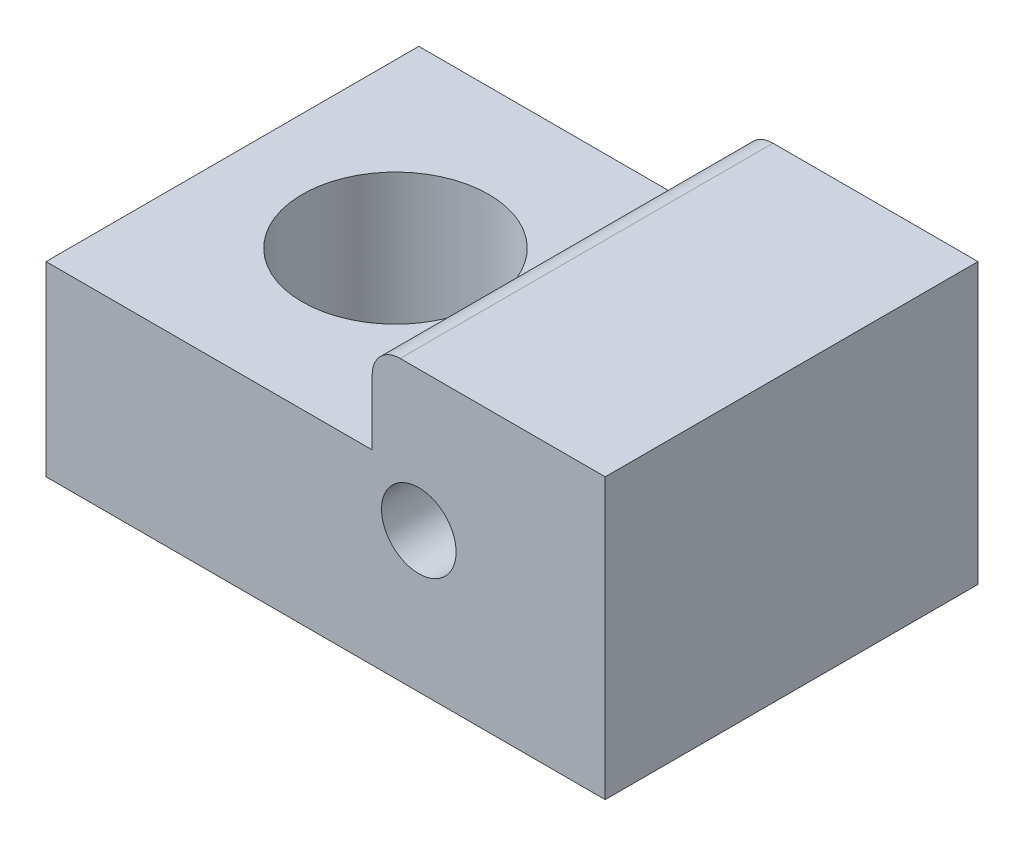
ISO-10303-21;
HEADER;
FILE_DESCRIPTION(('STEP AP214'),'2;1');
FILE_NAME('part.step','',(''),(''),'','','');
FILE_SCHEMA(('AUTOMOTIVE_DESIGN { 1 0 10303 214 1 1 1 1 }'));
ENDSEC;
DATA;
#1=APPLICATION_CONTEXT('core data for automotive mechanical design processes');
#2=APPLICATION_PROTOCOL_DEFINITION('international standard','automotive_design',2000,#1);
#3=PRODUCT_CONTEXT('',#1,'mechanical');
#4=PRODUCT('Part','Part','',(#3));
#5=PRODUCT_RELATED_PRODUCT_CATEGORY('part','',(#4));
#6=PRODUCT_DEFINITION_FORMATION('','',#4);
#7=PRODUCT_DEFINITION_CONTEXT('part definition',#1,'design');
#8=PRODUCT_DEFINITION('design','',#6,#7);
#9=PRODUCT_DEFINITION_SHAPE('','',#8);
#10=(LENGTH_UNIT() NAMED_UNIT(*) SI_UNIT(.MILLI.,.METRE.));
#11=(NAMED_UNIT(*) PLANE_ANGLE_UNIT() SI_UNIT($,.RADIAN.));
#12=(NAMED_UNIT(*) SI_UNIT($,.STERADIAN.) SOLID_ANGLE_UNIT());
#13=UNCERTAINTY_MEASURE_WITH_UNIT(LENGTH_MEASURE(1.E-05),#10,'distance_accuracy_value','');
#14=(GEOMETRIC_REPRESENTATION_CONTEXT(3) GLOBAL_UNCERTAINTY_ASSIGNED_CONTEXT((#13)) GLOBAL_UNIT_ASSIGNED_CONTEXT((#10,
#11,#12)) REPRESENTATION_CONTEXT('',''));
#15=CARTESIAN_POINT('',(0.,0.,0.));
#16=DIRECTION('',(0.,0.,1.));
#17=DIRECTION('',(1.,0.,0.));
#18=AXIS2_PLACEMENT_3D('',#15,#16,#17);
#19=CARTESIAN_POINT('',(8.,12.,40.));
#20=DIRECTION('',(0.,0.,1.));
#21=DIRECTION('',(1.,0.,0.));
#22=AXIS2_PLACEMENT_3D('',#19,#20,#21);
#23=PLANE('',#22);
#24=DIRECTION('',(0.,1.,0.));
#25=VECTOR('',#24,1.);
#26=CARTESIAN_POINT('',(30.,15.,40.));
#27=LINE('',#26,#25);
#28=CARTESIAN_POINT('',(30.,-15.,40.));
#29=VERTEX_POINT('',#28);
#30=CARTESIAN_POINT('',(30.,15.,40.));
#31=VERTEX_POINT('',#30);
#32=EDGE_CURVE('E143',#29,#31,#27,.T.);
#33=ORIENTED_EDGE('',*,*,#32,.T.);
#34=DIRECTION('',(-1.,0.,0.));
#35=VECTOR('',#34,1.);
#36=CARTESIAN_POINT('',(8.00000000000002,15.,40.));
#37=LINE('',#36,#35);
#38=CARTESIAN_POINT('',(8.00000000000002,15.,40.));
#39=VERTEX_POINT('',#38);
#40=EDGE_CURVE('E96',#31,#39,#37,.T.);
#41=ORIENTED_EDGE('',*,*,#40,.T.);
#42=CARTESIAN_POINT('',(8.,12.,40.));
#43=DIRECTION('',(0.,0.,1.));
#44=DIRECTION('',(1.,0.,0.));
#45=AXIS2_PLACEMENT_3D('',#42,#43,#44);
#46=CIRCLE('',#45,3.);
#47=CARTESIAN_POINT('',(5.,12.,40.));
#48=VERTEX_POINT('',#47);
#49=EDGE_CURVE('E156',#39,#48,#46,.T.);
#50=ORIENTED_EDGE('',*,*,#49,.T.);
#51=DIRECTION('',(0.,-1.,0.));
#52=VECTOR('',#51,1.);
#53=CARTESIAN_POINT('',(5.,12.,40.));
#54=LINE('',#53,#52);
#55=CARTESIAN_POINT('',(5.,5.,40.));
#56=VERTEX_POINT('',#55);
#57=EDGE_CURVE('E112',#48,#56,#54,.T.);
#58=ORIENTED_EDGE('',*,*,#57,.T.);
#59=DIRECTION('',(-1.,0.,0.));
#60=VECTOR('',#59,1.);
#61=CARTESIAN_POINT('',(-30.,5.,40.));
#62=LINE('',#61,#60);
#63=CARTESIAN_POINT('',(-30.,5.,40.));
#64=VERTEX_POINT('',#63);
#65=EDGE_CURVE('E106',#56,#64,#62,.T.);
#66=ORIENTED_EDGE('',*,*,#65,.T.);
#67=DIRECTION('',(0.,-1.,0.));
#68=VECTOR('',#67,1.);
#69=CARTESIAN_POINT('',(-30.,5.,40.));
#70=LINE('',#69,#68);
#71=CARTESIAN_POINT('',(-30.,-15.,40.));
#72=VERTEX_POINT('',#71);
#73=EDGE_CURVE('E110',#64,#72,#70,.T.);
#74=ORIENTED_EDGE('',*,*,#73,.T.);
#75=DIRECTION('',(1.,0.,0.));
#76=VECTOR('',#75,1.);
#77=CARTESIAN_POINT('',(-30.,-15.,40.));
#78=LINE('',#77,#76);
#79=EDGE_CURVE('E56',#72,#29,#78,.T.);
#80=ORIENTED_EDGE('',*,*,#79,.T.);
#81=EDGE_LOOP('',(#33,#41,#50,#58,#66,#74,#80));
#82=FACE_BOUND('',#81,.T.);
#83=CARTESIAN_POINT('',(9.99999999999999,0.,40.));
#84=DIRECTION('',(0.,0.,1.));
#85=DIRECTION('',(1.,0.,0.));
#86=AXIS2_PLACEMENT_3D('',#83,#84,#85);
#87=CIRCLE('',#86,4.);
#88=CARTESIAN_POINT('',(14.,0.,40.));
#89=VERTEX_POINT('',#88);
#90=EDGE_CURVE('E134',#89,#89,#87,.T.);
#91=ORIENTED_EDGE('',*,*,#90,.F.);
#92=EDGE_LOOP('',(#91));
#93=FACE_BOUND('',#92,.T.);
#94=ADVANCED_FACE('F38',(#82,#93),#23,.T.);
#95=CARTESIAN_POINT('',(8.,12.,0.));
#96=DIRECTION('',(0.,0.,1.));
#97=DIRECTION('',(1.,0.,0.));
#98=AXIS2_PLACEMENT_3D('',#95,#96,#97);
#99=PLANE('',#98);
#100=DIRECTION('',(0.,1.,0.));
#101=VECTOR('',#100,1.);
#102=CARTESIAN_POINT('',(30.,15.,0.));
#103=LINE('',#102,#101);
#104=CARTESIAN_POINT('',(30.,-15.,0.));
#105=VERTEX_POINT('',#104);
#106=CARTESIAN_POINT('',(30.,15.,0.));
#107=VERTEX_POINT('',#106);
#108=EDGE_CURVE('E130',#105,#107,#103,.T.);
#109=ORIENTED_EDGE('',*,*,#108,.F.);
#110=DIRECTION('',(1.,0.,0.));
#111=VECTOR('',#110,1.);
#112=CARTESIAN_POINT('',(-30.,-15.,0.));
#113=LINE('',#112,#111);
#114=CARTESIAN_POINT('',(-30.,-15.,0.));
#115=VERTEX_POINT('',#114);
#116=EDGE_CURVE('E88',#115,#105,#113,.T.);
#117=ORIENTED_EDGE('',*,*,#116,.F.);
#118=DIRECTION('',(0.,-1.,0.));
#119=VECTOR('',#118,1.);
#120=CARTESIAN_POINT('',(-30.,5.,0.));
#121=LINE('',#120,#119);
#122=CARTESIAN_POINT('',(-30.,5.,0.));
#123=VERTEX_POINT('',#122);
#124=EDGE_CURVE('E82',#123,#115,#121,.T.);
#125=ORIENTED_EDGE('',*,*,#124,.F.);
#126=DIRECTION('',(-1.,0.,0.));
#127=VECTOR('',#126,1.);
#128=CARTESIAN_POINT('',(-30.,5.,0.));
#129=LINE('',#128,#127);
#130=CARTESIAN_POINT('',(5.,5.,0.));
#131=VERTEX_POINT('',#130);
#132=EDGE_CURVE('E120',#131,#123,#129,.T.);
#133=ORIENTED_EDGE('',*,*,#132,.F.);
#134=DIRECTION('',(0.,-1.,0.));
#135=VECTOR('',#134,1.);
#136=CARTESIAN_POINT('',(5.,12.,0.));
#137=LINE('',#136,#135);
#138=CARTESIAN_POINT('',(5.,12.,0.));
#139=VERTEX_POINT('',#138);
#140=EDGE_CURVE('E138',#139,#131,#137,.T.);
#141=ORIENTED_EDGE('',*,*,#140,.F.);
#142=CARTESIAN_POINT('',(8.,12.,0.));
#143=DIRECTION('',(0.,0.,1.));
#144=DIRECTION('',(1.,0.,0.));
#145=AXIS2_PLACEMENT_3D('',#142,#143,#144);
#146=CIRCLE('',#145,3.);
#147=CARTESIAN_POINT('',(8.00000000000002,15.,0.));
#148=VERTEX_POINT('',#147);
#149=EDGE_CURVE('E136',#148,#139,#146,.T.);
#150=ORIENTED_EDGE('',*,*,#149,.F.);
#151=DIRECTION('',(-1.,0.,0.));
#152=VECTOR('',#151,1.);
#153=CARTESIAN_POINT('',(8.00000000000002,15.,0.));
#154=LINE('',#153,#152);
#155=EDGE_CURVE('E133',#107,#148,#154,.T.);
#156=ORIENTED_EDGE('',*,*,#155,.F.);
#157=EDGE_LOOP('',(#109,#117,#125,#133,#141,#150,#156));
#158=FACE_BOUND('',#157,.T.);
#159=CARTESIAN_POINT('',(9.99999999999999,0.,0.));
#160=DIRECTION('',(0.,0.,1.));
#161=DIRECTION('',(1.,0.,0.));
#162=AXIS2_PLACEMENT_3D('',#159,#160,#161);
#163=CIRCLE('',#162,4.);
#164=CARTESIAN_POINT('',(14.,0.,0.));
#165=VERTEX_POINT('',#164);
#166=EDGE_CURVE('E168',#165,#165,#163,.T.);
#167=ORIENTED_EDGE('',*,*,#166,.T.);
#168=EDGE_LOOP('',(#167));
#169=FACE_BOUND('',#168,.T.);
#170=ADVANCED_FACE('F160',(#158,#169),#99,.F.);
#171=CARTESIAN_POINT('',(30.,15.,40.));
#172=DIRECTION('',(-1.,0.,0.));
#173=DIRECTION('',(0.,-1.,0.));
#174=AXIS2_PLACEMENT_3D('',#171,#172,#173);
#175=PLANE('',#174);
#176=ORIENTED_EDGE('',*,*,#108,.T.);
#177=DIRECTION('',(0.,0.,-1.));
#178=VECTOR('',#177,1.);
#179=CARTESIAN_POINT('',(30.,15.,40.));
#180=LINE('',#179,#178);
#181=EDGE_CURVE('E11',#31,#107,#180,.T.);
#182=ORIENTED_EDGE('',*,*,#181,.F.);
#183=ORIENTED_EDGE('',*,*,#32,.F.);
#184=DIRECTION('',(0.,0.,-1.));
#185=VECTOR('',#184,1.);
#186=CARTESIAN_POINT('',(30.,-15.,40.));
#187=LINE('',#186,#185);
#188=EDGE_CURVE('E126',#29,#105,#187,.T.);
#189=ORIENTED_EDGE('',*,*,#188,.T.);
#190=EDGE_LOOP('',(#176,#182,#183,#189));
#191=FACE_BOUND('',#190,.T.);
#192=ADVANCED_FACE('F40',(#191),#175,.F.);
#193=CARTESIAN_POINT('',(8.00000000000002,15.,40.));
#194=DIRECTION('',(0.,-1.,0.));
#195=DIRECTION('',(1.,0.,0.));
#196=AXIS2_PLACEMENT_3D('',#193,#194,#195);
#197=PLANE('',#196);
#198=ORIENTED_EDGE('',*,*,#155,.T.);
#199=DIRECTION('',(0.,0.,-1.));
#200=VECTOR('',#199,1.);
#201=CARTESIAN_POINT('',(8.00000000000002,15.,40.));
#202=LINE('',#201,#200);
#203=EDGE_CURVE('E48',#39,#148,#202,.T.);
#204=ORIENTED_EDGE('',*,*,#203,.F.);
#205=ORIENTED_EDGE('',*,*,#40,.F.);
#206=ORIENTED_EDGE('',*,*,#181,.T.);
#207=EDGE_LOOP('',(#198,#204,#205,#206));
#208=FACE_BOUND('',#207,.T.);
#209=ADVANCED_FACE('F249',(#208),#197,.F.);
#210=CARTESIAN_POINT('',(8.,12.,40.));
#211=DIRECTION('',(0.,0.,-1.));
#212=DIRECTION('',(-1.,0.,0.));
#213=AXIS2_PLACEMENT_3D('',#210,#211,#212);
#214=CYLINDRICAL_SURFACE('',#213,3.);
#215=ORIENTED_EDGE('',*,*,#149,.T.);
#216=DIRECTION('',(0.,0.,-1.));
#217=VECTOR('',#216,1.);
#218=CARTESIAN_POINT('',(5.,12.,40.));
#219=LINE('',#218,#217);
#220=EDGE_CURVE('E147',#48,#139,#219,.T.);
#221=ORIENTED_EDGE('',*,*,#220,.F.);
#222=ORIENTED_EDGE('',*,*,#49,.F.);
#223=ORIENTED_EDGE('',*,*,#203,.T.);
#224=EDGE_LOOP('',(#215,#221,#222,#223));
#225=FACE_BOUND('',#224,.T.);
#226=ADVANCED_FACE('F154',(#225),#214,.T.);
#227=CARTESIAN_POINT('',(5.,12.,40.));
#228=DIRECTION('',(1.,0.,0.));
#229=DIRECTION('',(0.,0.,-1.));
#230=AXIS2_PLACEMENT_3D('',#227,#228,#229);
#231=PLANE('',#230);
#232=ORIENTED_EDGE('',*,*,#140,.T.);
#233=DIRECTION('',(0.,0.,-1.));
#234=VECTOR('',#233,1.);
#235=CARTESIAN_POINT('',(5.,5.,40.));
#236=LINE('',#235,#234);
#237=EDGE_CURVE('E121',#56,#131,#236,.T.);
#238=ORIENTED_EDGE('',*,*,#237,.F.);
#239=ORIENTED_EDGE('',*,*,#57,.F.);
#240=ORIENTED_EDGE('',*,*,#220,.T.);
#241=EDGE_LOOP('',(#232,#238,#239,#240));
#242=FACE_BOUND('',#241,.T.);
#243=ADVANCED_FACE('F163',(#242),#231,.F.);
#244=CARTESIAN_POINT('',(-30.,5.,40.));
#245=DIRECTION('',(0.,-1.,0.));
#246=DIRECTION('',(0.,0.,-1.));
#247=AXIS2_PLACEMENT_3D('',#244,#245,#246);
#248=PLANE('',#247);
#249=CARTESIAN_POINT('',(-12.5,5.,20.));
#250=DIRECTION('',(0.,-1.,0.));
#251=DIRECTION('',(0.,0.,-1.));
#252=AXIS2_PLACEMENT_3D('',#249,#250,#251);
#253=CIRCLE('',#252,10.);
#254=CARTESIAN_POINT('',(-12.5,5.,10.));
#255=VERTEX_POINT('',#254);
#256=EDGE_CURVE('E173',#255,#255,#253,.T.);
#257=ORIENTED_EDGE('',*,*,#256,.T.);
#258=EDGE_LOOP('',(#257));
#259=FACE_BOUND('',#258,.T.);
#260=ORIENTED_EDGE('',*,*,#132,.T.);
#261=DIRECTION('',(0.,0.,-1.));
#262=VECTOR('',#261,1.);
#263=CARTESIAN_POINT('',(-30.,5.,40.));
#264=LINE('',#263,#262);
#265=EDGE_CURVE('E117',#64,#123,#264,.T.);
#266=ORIENTED_EDGE('',*,*,#265,.F.);
#267=ORIENTED_EDGE('',*,*,#65,.F.);
#268=ORIENTED_EDGE('',*,*,#237,.T.);
#269=EDGE_LOOP('',(#260,#266,#267,#268));
#270=FACE_BOUND('',#269,.T.);
#271=ADVANCED_FACE('F118',(#259,#270),#248,.F.);
#272=CARTESIAN_POINT('',(-30.,5.,40.));
#273=DIRECTION('',(1.,0.,0.));
#274=DIRECTION('',(0.,1.,0.));
#275=AXIS2_PLACEMENT_3D('',#272,#273,#274);
#276=PLANE('',#275);
#277=ORIENTED_EDGE('',*,*,#124,.T.);
#278=DIRECTION('',(0.,0.,-1.));
#279=VECTOR('',#278,1.);
#280=CARTESIAN_POINT('',(-30.,-15.,40.));
#281=LINE('',#280,#279);
#282=EDGE_CURVE('E122',#72,#115,#281,.T.);
#283=ORIENTED_EDGE('',*,*,#282,.F.);
#284=ORIENTED_EDGE('',*,*,#73,.F.);
#285=ORIENTED_EDGE('',*,*,#265,.T.);
#286=EDGE_LOOP('',(#277,#283,#284,#285));
#287=FACE_BOUND('',#286,.T.);
#288=ADVANCED_FACE('F124',(#287),#276,.F.);
#289=CARTESIAN_POINT('',(-30.,-15.,40.));
#290=DIRECTION('',(0.,1.,0.));
#291=DIRECTION('',(0.,0.,1.));
#292=AXIS2_PLACEMENT_3D('',#289,#290,#291);
#293=PLANE('',#292);
#294=CARTESIAN_POINT('',(-12.5,-15.,20.));
#295=DIRECTION('',(0.,1.,0.));
#296=DIRECTION('',(0.,0.,1.));
#297=AXIS2_PLACEMENT_3D('',#294,#295,#296);
#298=CIRCLE('',#297,10.);
#299=CARTESIAN_POINT('',(-12.5,-15.,30.));
#300=VERTEX_POINT('',#299);
#301=EDGE_CURVE('E42',#300,#300,#298,.F.);
#302=ORIENTED_EDGE('',*,*,#301,.F.);
#303=EDGE_LOOP('',(#302));
#304=FACE_BOUND('',#303,.T.);
#305=ORIENTED_EDGE('',*,*,#116,.T.);
#306=ORIENTED_EDGE('',*,*,#188,.F.);
#307=ORIENTED_EDGE('',*,*,#79,.F.);
#308=ORIENTED_EDGE('',*,*,#282,.T.);
#309=EDGE_LOOP('',(#305,#306,#307,#308));
#310=FACE_BOUND('',#309,.T.);
#311=ADVANCED_FACE('F182',(#304,#310),#293,.F.);
#312=CARTESIAN_POINT('',(9.99999999999999,0.,40.));
#313=DIRECTION('',(0.,0.,-1.));
#314=DIRECTION('',(-1.,0.,0.));
#315=AXIS2_PLACEMENT_3D('',#312,#313,#314);
#316=CYLINDRICAL_SURFACE('',#315,4.);
#317=ORIENTED_EDGE('',*,*,#90,.T.);
#318=EDGE_LOOP('',(#317));
#319=FACE_BOUND('',#318,.T.);
#320=ORIENTED_EDGE('',*,*,#166,.F.);
#321=EDGE_LOOP('',(#320));
#322=FACE_BOUND('',#321,.T.);
#323=ADVANCED_FACE('F184',(#319,#322),#316,.F.);
#324=CARTESIAN_POINT('',(-12.5,-35.,20.));
#325=DIRECTION('',(0.,1.,0.));
#326=DIRECTION('',(0.,0.,1.));
#327=AXIS2_PLACEMENT_3D('',#324,#325,#326);
#328=CYLINDRICAL_SURFACE('',#327,10.);
#329=ORIENTED_EDGE('',*,*,#256,.F.);
#330=EDGE_LOOP('',(#329));
#331=FACE_BOUND('',#330,.T.);
#332=ORIENTED_EDGE('',*,*,#301,.T.);
#333=EDGE_LOOP('',(#332));
#334=FACE_BOUND('',#333,.T.);
#335=ADVANCED_FACE('F180',(#331,#334),#328,.F.);
#336=CLOSED_SHELL('',(#94,#170,#192,#209,#226,#243,#271,#288,#311,#323,#335));
#337=MANIFOLD_SOLID_BREP('B2',#336);
#338=ADVANCED_BREP_SHAPE_REPRESENTATION('',(#18,#337),#14);
#339=SHAPE_DEFINITION_REPRESENTATION(#9,#338);
ENDSEC;
END-ISO-10303-21;
